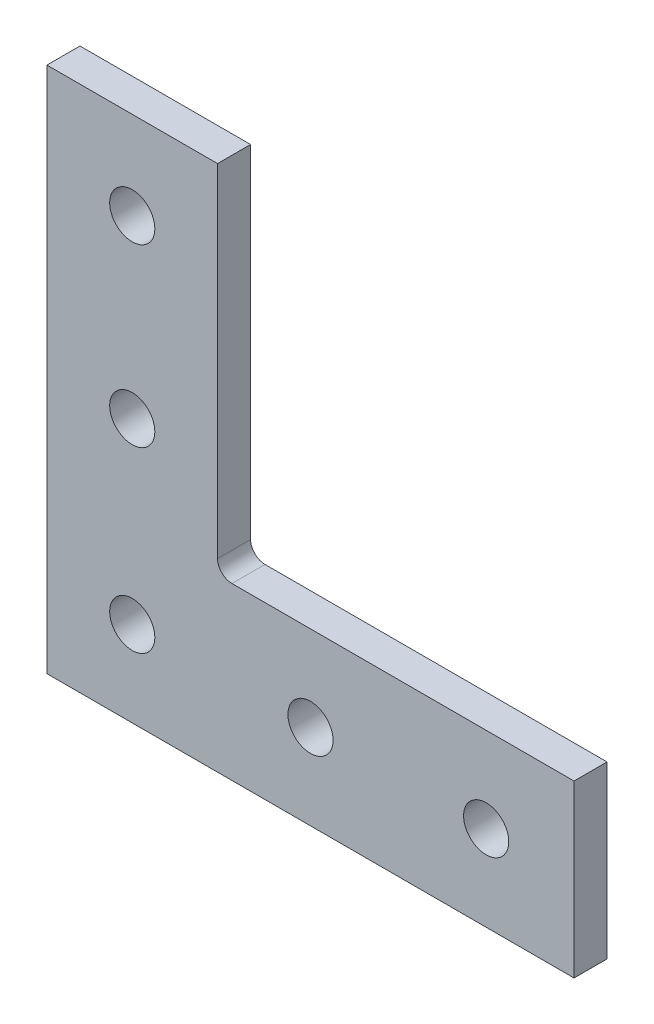
ISO-10303-21;
HEADER;
FILE_DESCRIPTION(('STEP AP214'),'2;1');
FILE_NAME('part.step','',(''),(''),'','','');
FILE_SCHEMA(('AUTOMOTIVE_DESIGN { 1 0 10303 214 1 1 1 1 }'));
ENDSEC;
DATA;
#1=APPLICATION_CONTEXT('core data for automotive mechanical design processes');
#2=APPLICATION_PROTOCOL_DEFINITION('international standard','automotive_design',2000,#1);
#3=PRODUCT_CONTEXT('',#1,'mechanical');
#4=PRODUCT('Part','Part','',(#3));
#5=PRODUCT_RELATED_PRODUCT_CATEGORY('part','',(#4));
#6=PRODUCT_DEFINITION_FORMATION('','',#4);
#7=PRODUCT_DEFINITION_CONTEXT('part definition',#1,'design');
#8=PRODUCT_DEFINITION('design','',#6,#7);
#9=PRODUCT_DEFINITION_SHAPE('','',#8);
#10=(LENGTH_UNIT() NAMED_UNIT(*) SI_UNIT(.MILLI.,.METRE.));
#11=(NAMED_UNIT(*) PLANE_ANGLE_UNIT() SI_UNIT($,.RADIAN.));
#12=(NAMED_UNIT(*) SI_UNIT($,.STERADIAN.) SOLID_ANGLE_UNIT());
#13=UNCERTAINTY_MEASURE_WITH_UNIT(LENGTH_MEASURE(1.E-05),#10,'distance_accuracy_value','');
#14=(GEOMETRIC_REPRESENTATION_CONTEXT(3) GLOBAL_UNCERTAINTY_ASSIGNED_CONTEXT((#13)) GLOBAL_UNIT_ASSIGNED_CONTEXT((#10,
#11,#12)) REPRESENTATION_CONTEXT('',''));
#15=CARTESIAN_POINT('',(0.,0.,0.));
#16=DIRECTION('',(0.,0.,1.));
#17=DIRECTION('',(1.,0.,0.));
#18=AXIS2_PLACEMENT_3D('',#15,#16,#17);
#19=CARTESIAN_POINT('',(-13.4366,-11.3538,-2.3876));
#20=DIRECTION('',(1.,0.,0.));
#21=DIRECTION('',(0.,1.,0.));
#22=AXIS2_PLACEMENT_3D('',#19,#20,#21);
#23=PLANE('',#22);
#24=DIRECTION('',(0.,0.,1.));
#25=VECTOR('',#24,1.);
#26=CARTESIAN_POINT('',(-13.4366,38.1,-2.3876));
#27=LINE('',#26,#25);
#28=CARTESIAN_POINT('',(-13.4366,38.1,-2.3876));
#29=VERTEX_POINT('',#28);
#30=CARTESIAN_POINT('',(-13.4366,38.1,2.3876));
#31=VERTEX_POINT('',#30);
#32=EDGE_CURVE('E103',#29,#31,#27,.T.);
#33=ORIENTED_EDGE('',*,*,#32,.T.);
#34=DIRECTION('',(0.,1.,0.));
#35=VECTOR('',#34,1.);
#36=CARTESIAN_POINT('',(-13.4366,-11.3538,2.3876));
#37=LINE('',#36,#35);
#38=CARTESIAN_POINT('',(-13.4366,-11.3538,2.3876));
#39=VERTEX_POINT('',#38);
#40=EDGE_CURVE('E106',#39,#31,#37,.T.);
#41=ORIENTED_EDGE('',*,*,#40,.F.);
#42=DIRECTION('',(0.,0.,1.));
#43=VECTOR('',#42,1.);
#44=CARTESIAN_POINT('',(-13.4366,-11.3538,-2.3876));
#45=LINE('',#44,#43);
#46=CARTESIAN_POINT('',(-13.4366,-11.3538,-2.3876));
#47=VERTEX_POINT('',#46);
#48=EDGE_CURVE('E11',#47,#39,#45,.T.);
#49=ORIENTED_EDGE('',*,*,#48,.F.);
#50=DIRECTION('',(0.,1.,0.));
#51=VECTOR('',#50,1.);
#52=CARTESIAN_POINT('',(-13.4366,-11.3538,-2.3876));
#53=LINE('',#52,#51);
#54=EDGE_CURVE('E107',#47,#29,#53,.T.);
#55=ORIENTED_EDGE('',*,*,#54,.T.);
#56=EDGE_LOOP('',(#33,#41,#49,#55));
#57=FACE_BOUND('',#56,.T.);
#58=ADVANCED_FACE('F46',(#57),#23,.T.);
#59=CARTESIAN_POINT('',(-11.3538,-11.3538,-2.3876));
#60=DIRECTION('',(0.,0.,1.));
#61=DIRECTION('',(1.,0.,0.));
#62=AXIS2_PLACEMENT_3D('',#59,#60,#61);
#63=CYLINDRICAL_SURFACE('',#62,2.0828);
#64=ORIENTED_EDGE('',*,*,#48,.T.);
#65=CARTESIAN_POINT('',(-11.3538,-11.3538,2.3876));
#66=DIRECTION('',(0.,0.,-1.));
#67=DIRECTION('',(-1.,0.,0.));
#68=AXIS2_PLACEMENT_3D('',#65,#66,#67);
#69=CIRCLE('',#68,2.0828);
#70=CARTESIAN_POINT('',(-11.3538,-13.4366,2.3876));
#71=VERTEX_POINT('',#70);
#72=EDGE_CURVE('E127',#71,#39,#69,.T.);
#73=ORIENTED_EDGE('',*,*,#72,.F.);
#74=DIRECTION('',(0.,0.,1.));
#75=VECTOR('',#74,1.);
#76=CARTESIAN_POINT('',(-11.3538,-13.4366,-2.3876));
#77=LINE('',#76,#75);
#78=CARTESIAN_POINT('',(-11.3538,-13.4366,-2.3876));
#79=VERTEX_POINT('',#78);
#80=EDGE_CURVE('E55',#79,#71,#77,.T.);
#81=ORIENTED_EDGE('',*,*,#80,.F.);
#82=CARTESIAN_POINT('',(-11.3538,-11.3538,-2.3876));
#83=DIRECTION('',(0.,0.,-1.));
#84=DIRECTION('',(-1.,0.,0.));
#85=AXIS2_PLACEMENT_3D('',#82,#83,#84);
#86=CIRCLE('',#85,2.0828);
#87=EDGE_CURVE('E113',#79,#47,#86,.T.);
#88=ORIENTED_EDGE('',*,*,#87,.T.);
#89=EDGE_LOOP('',(#64,#73,#81,#88));
#90=FACE_BOUND('',#89,.T.);
#91=ADVANCED_FACE('F225',(#90),#63,.F.);
#92=CARTESIAN_POINT('',(38.1,-13.4366,-2.3876));
#93=DIRECTION('',(0.,1.,0.));
#94=DIRECTION('',(-1.,0.,0.));
#95=AXIS2_PLACEMENT_3D('',#92,#93,#94);
#96=PLANE('',#95);
#97=ORIENTED_EDGE('',*,*,#80,.T.);
#98=DIRECTION('',(-1.,0.,0.));
#99=VECTOR('',#98,1.);
#100=CARTESIAN_POINT('',(38.1,-13.4366,2.3876));
#101=LINE('',#100,#99);
#102=CARTESIAN_POINT('',(38.1,-13.4366,2.3876));
#103=VERTEX_POINT('',#102);
#104=EDGE_CURVE('E148',#103,#71,#101,.T.);
#105=ORIENTED_EDGE('',*,*,#104,.F.);
#106=DIRECTION('',(0.,0.,1.));
#107=VECTOR('',#106,1.);
#108=CARTESIAN_POINT('',(38.1,-13.4366,-2.3876));
#109=LINE('',#108,#107);
#110=CARTESIAN_POINT('',(38.1,-13.4366,-2.3876));
#111=VERTEX_POINT('',#110);
#112=EDGE_CURVE('E177',#111,#103,#109,.T.);
#113=ORIENTED_EDGE('',*,*,#112,.F.);
#114=DIRECTION('',(-1.,0.,0.));
#115=VECTOR('',#114,1.);
#116=CARTESIAN_POINT('',(38.1,-13.4366,-2.3876));
#117=LINE('',#116,#115);
#118=EDGE_CURVE('E170',#111,#79,#117,.T.);
#119=ORIENTED_EDGE('',*,*,#118,.T.);
#120=EDGE_LOOP('',(#97,#105,#113,#119));
#121=FACE_BOUND('',#120,.T.);
#122=ADVANCED_FACE('F229',(#121),#96,.T.);
#123=CARTESIAN_POINT('',(38.1,-38.1,-2.3876));
#124=DIRECTION('',(1.,0.,0.));
#125=DIRECTION('',(0.,0.,-1.));
#126=AXIS2_PLACEMENT_3D('',#123,#124,#125);
#127=PLANE('',#126);
#128=ORIENTED_EDGE('',*,*,#112,.T.);
#129=DIRECTION('',(0.,1.,0.));
#130=VECTOR('',#129,1.);
#131=CARTESIAN_POINT('',(38.1,-38.1,2.3876));
#132=LINE('',#131,#130);
#133=CARTESIAN_POINT('',(38.1,-38.1,2.3876));
#134=VERTEX_POINT('',#133);
#135=EDGE_CURVE('E144',#134,#103,#132,.T.);
#136=ORIENTED_EDGE('',*,*,#135,.F.);
#137=DIRECTION('',(0.,0.,1.));
#138=VECTOR('',#137,1.);
#139=CARTESIAN_POINT('',(38.1,-38.1,-2.3876));
#140=LINE('',#139,#138);
#141=CARTESIAN_POINT('',(38.1,-38.1,-2.3876));
#142=VERTEX_POINT('',#141);
#143=EDGE_CURVE('E180',#142,#134,#140,.T.);
#144=ORIENTED_EDGE('',*,*,#143,.F.);
#145=DIRECTION('',(0.,1.,0.));
#146=VECTOR('',#145,1.);
#147=CARTESIAN_POINT('',(38.1,-38.1,-2.3876));
#148=LINE('',#147,#146);
#149=EDGE_CURVE('E166',#142,#111,#148,.T.);
#150=ORIENTED_EDGE('',*,*,#149,.T.);
#151=EDGE_LOOP('',(#128,#136,#144,#150));
#152=FACE_BOUND('',#151,.T.);
#153=ADVANCED_FACE('F234',(#152),#127,.T.);
#154=CARTESIAN_POINT('',(-38.1,-38.1,-2.3876));
#155=DIRECTION('',(0.,-1.,0.));
#156=DIRECTION('',(1.,0.,0.));
#157=AXIS2_PLACEMENT_3D('',#154,#155,#156);
#158=PLANE('',#157);
#159=ORIENTED_EDGE('',*,*,#143,.T.);
#160=DIRECTION('',(1.,0.,0.));
#161=VECTOR('',#160,1.);
#162=CARTESIAN_POINT('',(-38.1,-38.1,2.3876));
#163=LINE('',#162,#161);
#164=CARTESIAN_POINT('',(-38.1,-38.1,2.3876));
#165=VERTEX_POINT('',#164);
#166=EDGE_CURVE('E140',#165,#134,#163,.T.);
#167=ORIENTED_EDGE('',*,*,#166,.F.);
#168=DIRECTION('',(0.,0.,1.));
#169=VECTOR('',#168,1.);
#170=CARTESIAN_POINT('',(-38.1,-38.1,-2.3876));
#171=LINE('',#170,#169);
#172=CARTESIAN_POINT('',(-38.1,-38.1,-2.3876));
#173=VERTEX_POINT('',#172);
#174=EDGE_CURVE('E183',#173,#165,#171,.T.);
#175=ORIENTED_EDGE('',*,*,#174,.F.);
#176=DIRECTION('',(1.,0.,0.));
#177=VECTOR('',#176,1.);
#178=CARTESIAN_POINT('',(-38.1,-38.1,-2.3876));
#179=LINE('',#178,#177);
#180=EDGE_CURVE('E162',#173,#142,#179,.T.);
#181=ORIENTED_EDGE('',*,*,#180,.T.);
#182=EDGE_LOOP('',(#159,#167,#175,#181));
#183=FACE_BOUND('',#182,.T.);
#184=ADVANCED_FACE('F243',(#183),#158,.T.);
#185=CARTESIAN_POINT('',(-38.1,38.1,-2.3876));
#186=DIRECTION('',(-1.,0.,0.));
#187=DIRECTION('',(0.,-1.,0.));
#188=AXIS2_PLACEMENT_3D('',#185,#186,#187);
#189=PLANE('',#188);
#190=ORIENTED_EDGE('',*,*,#174,.T.);
#191=DIRECTION('',(0.,-1.,0.));
#192=VECTOR('',#191,1.);
#193=CARTESIAN_POINT('',(-38.1,38.1,2.3876));
#194=LINE('',#193,#192);
#195=CARTESIAN_POINT('',(-38.1,38.1,2.3876));
#196=VERTEX_POINT('',#195);
#197=EDGE_CURVE('E122',#196,#165,#194,.T.);
#198=ORIENTED_EDGE('',*,*,#197,.F.);
#199=DIRECTION('',(0.,0.,1.));
#200=VECTOR('',#199,1.);
#201=CARTESIAN_POINT('',(-38.1,38.1,-2.3876));
#202=LINE('',#201,#200);
#203=CARTESIAN_POINT('',(-38.1,38.1,-2.3876));
#204=VERTEX_POINT('',#203);
#205=EDGE_CURVE('E112',#204,#196,#202,.T.);
#206=ORIENTED_EDGE('',*,*,#205,.F.);
#207=DIRECTION('',(0.,-1.,0.));
#208=VECTOR('',#207,1.);
#209=CARTESIAN_POINT('',(-38.1,38.1,-2.3876));
#210=LINE('',#209,#208);
#211=EDGE_CURVE('E158',#204,#173,#210,.T.);
#212=ORIENTED_EDGE('',*,*,#211,.T.);
#213=EDGE_LOOP('',(#190,#198,#206,#212));
#214=FACE_BOUND('',#213,.T.);
#215=ADVANCED_FACE('F247',(#214),#189,.T.);
#216=CARTESIAN_POINT('',(-13.4366,38.1,-2.3876));
#217=DIRECTION('',(0.,1.,0.));
#218=DIRECTION('',(0.,0.,1.));
#219=AXIS2_PLACEMENT_3D('',#216,#217,#218);
#220=PLANE('',#219);
#221=ORIENTED_EDGE('',*,*,#205,.T.);
#222=DIRECTION('',(-1.,0.,0.));
#223=VECTOR('',#222,1.);
#224=CARTESIAN_POINT('',(-13.4366,38.1,2.3876));
#225=LINE('',#224,#223);
#226=EDGE_CURVE('E116',#31,#196,#225,.T.);
#227=ORIENTED_EDGE('',*,*,#226,.F.);
#228=ORIENTED_EDGE('',*,*,#32,.F.);
#229=DIRECTION('',(-1.,0.,0.));
#230=VECTOR('',#229,1.);
#231=CARTESIAN_POINT('',(-13.4366,38.1,-2.3876));
#232=LINE('',#231,#230);
#233=EDGE_CURVE('E155',#29,#204,#232,.T.);
#234=ORIENTED_EDGE('',*,*,#233,.T.);
#235=EDGE_LOOP('',(#221,#227,#228,#234));
#236=FACE_BOUND('',#235,.T.);
#237=ADVANCED_FACE('F117',(#236),#220,.T.);
#238=CARTESIAN_POINT('',(-11.3538,-11.3538,-2.3876));
#239=DIRECTION('',(0.,0.,-1.));
#240=DIRECTION('',(-1.,0.,0.));
#241=AXIS2_PLACEMENT_3D('',#238,#239,#240);
#242=PLANE('',#241);
#243=CARTESIAN_POINT('',(-25.7683,25.4,-2.3876));
#244=DIRECTION('',(0.,0.,1.));
#245=DIRECTION('',(1.,0.,0.));
#246=AXIS2_PLACEMENT_3D('',#243,#244,#245);
#247=CIRCLE('',#246,3.26389999999999);
#248=CARTESIAN_POINT('',(-22.5044,25.4,-2.3876));
#249=VERTEX_POINT('',#248);
#250=EDGE_CURVE('E193',#249,#249,#247,.T.);
#251=ORIENTED_EDGE('',*,*,#250,.T.);
#252=EDGE_LOOP('',(#251));
#253=FACE_BOUND('',#252,.T.);
#254=CARTESIAN_POINT('',(-25.7683,-25.7683,-2.3876));
#255=DIRECTION('',(0.,0.,1.));
#256=DIRECTION('',(1.,0.,0.));
#257=AXIS2_PLACEMENT_3D('',#254,#255,#256);
#258=CIRCLE('',#257,3.26389999999999);
#259=CARTESIAN_POINT('',(-22.5044,-25.7683,-2.3876));
#260=VERTEX_POINT('',#259);
#261=EDGE_CURVE('E266',#260,#260,#258,.T.);
#262=ORIENTED_EDGE('',*,*,#261,.T.);
#263=EDGE_LOOP('',(#262));
#264=FACE_BOUND('',#263,.T.);
#265=CARTESIAN_POINT('',(25.4,-25.7683,-2.3876));
#266=DIRECTION('',(0.,0.,1.));
#267=DIRECTION('',(-1.,0.,0.));
#268=AXIS2_PLACEMENT_3D('',#265,#266,#267);
#269=CIRCLE('',#268,3.26389999999999);
#270=CARTESIAN_POINT('',(22.1361,-25.7683,-2.3876));
#271=VERTEX_POINT('',#270);
#272=EDGE_CURVE('E270',#271,#271,#269,.T.);
#273=ORIENTED_EDGE('',*,*,#272,.T.);
#274=EDGE_LOOP('',(#273));
#275=FACE_BOUND('',#274,.T.);
#276=CARTESIAN_POINT('',(0.,-25.7683,-2.3876));
#277=DIRECTION('',(0.,0.,1.));
#278=DIRECTION('',(-1.,0.,0.));
#279=AXIS2_PLACEMENT_3D('',#276,#277,#278);
#280=CIRCLE('',#279,3.26389999999999);
#281=CARTESIAN_POINT('',(-3.2639,-25.7683,-2.3876));
#282=VERTEX_POINT('',#281);
#283=EDGE_CURVE('E135',#282,#282,#280,.T.);
#284=ORIENTED_EDGE('',*,*,#283,.T.);
#285=EDGE_LOOP('',(#284));
#286=FACE_BOUND('',#285,.T.);
#287=CARTESIAN_POINT('',(-25.7683,0.,-2.3876));
#288=DIRECTION('',(0.,0.,1.));
#289=DIRECTION('',(1.,0.,0.));
#290=AXIS2_PLACEMENT_3D('',#287,#288,#289);
#291=CIRCLE('',#290,3.26389999999999);
#292=CARTESIAN_POINT('',(-22.5044,0.,-2.3876));
#293=VERTEX_POINT('',#292);
#294=EDGE_CURVE('E277',#293,#293,#291,.T.);
#295=ORIENTED_EDGE('',*,*,#294,.T.);
#296=EDGE_LOOP('',(#295));
#297=FACE_BOUND('',#296,.T.);
#298=ORIENTED_EDGE('',*,*,#54,.F.);
#299=ORIENTED_EDGE('',*,*,#87,.F.);
#300=ORIENTED_EDGE('',*,*,#118,.F.);
#301=ORIENTED_EDGE('',*,*,#149,.F.);
#302=ORIENTED_EDGE('',*,*,#180,.F.);
#303=ORIENTED_EDGE('',*,*,#211,.F.);
#304=ORIENTED_EDGE('',*,*,#233,.F.);
#305=EDGE_LOOP('',(#298,#299,#300,#301,#302,#303,#304));
#306=FACE_BOUND('',#305,.T.);
#307=ADVANCED_FACE('F238',(#253,#264,#275,#286,#297,#306),#242,.T.);
#308=CARTESIAN_POINT('',(-11.3538,-11.3538,2.3876));
#309=DIRECTION('',(0.,0.,-1.));
#310=DIRECTION('',(-1.,0.,0.));
#311=AXIS2_PLACEMENT_3D('',#308,#309,#310);
#312=PLANE('',#311);
#313=CARTESIAN_POINT('',(-25.7683,25.4,2.3876));
#314=DIRECTION('',(0.,0.,-1.));
#315=DIRECTION('',(-1.,0.,0.));
#316=AXIS2_PLACEMENT_3D('',#313,#314,#315);
#317=CIRCLE('',#316,3.26389999999999);
#318=CARTESIAN_POINT('',(-29.0322,25.4,2.3876));
#319=VERTEX_POINT('',#318);
#320=EDGE_CURVE('E49',#319,#319,#317,.T.);
#321=ORIENTED_EDGE('',*,*,#320,.T.);
#322=EDGE_LOOP('',(#321));
#323=FACE_BOUND('',#322,.T.);
#324=CARTESIAN_POINT('',(-25.7683,-25.7683,2.3876));
#325=DIRECTION('',(0.,0.,-1.));
#326=DIRECTION('',(-1.,0.,0.));
#327=AXIS2_PLACEMENT_3D('',#324,#325,#326);
#328=CIRCLE('',#327,3.26389999999999);
#329=CARTESIAN_POINT('',(-29.0322,-25.7683,2.3876));
#330=VERTEX_POINT('',#329);
#331=EDGE_CURVE('E133',#330,#330,#328,.T.);
#332=ORIENTED_EDGE('',*,*,#331,.T.);
#333=EDGE_LOOP('',(#332));
#334=FACE_BOUND('',#333,.T.);
#335=CARTESIAN_POINT('',(25.4,-25.7683,2.3876));
#336=DIRECTION('',(0.,0.,-1.));
#337=DIRECTION('',(-1.,0.,0.));
#338=AXIS2_PLACEMENT_3D('',#335,#336,#337);
#339=CIRCLE('',#338,3.26389999999999);
#340=CARTESIAN_POINT('',(22.1361,-25.7683,2.3876));
#341=VERTEX_POINT('',#340);
#342=EDGE_CURVE('E197',#341,#341,#339,.T.);
#343=ORIENTED_EDGE('',*,*,#342,.T.);
#344=EDGE_LOOP('',(#343));
#345=FACE_BOUND('',#344,.T.);
#346=CARTESIAN_POINT('',(0.,-25.7683,2.3876));
#347=DIRECTION('',(0.,0.,-1.));
#348=DIRECTION('',(-1.,0.,0.));
#349=AXIS2_PLACEMENT_3D('',#346,#347,#348);
#350=CIRCLE('',#349,3.26389999999999);
#351=CARTESIAN_POINT('',(-3.2639,-25.7683,2.3876));
#352=VERTEX_POINT('',#351);
#353=EDGE_CURVE('E192',#352,#352,#350,.T.);
#354=ORIENTED_EDGE('',*,*,#353,.T.);
#355=EDGE_LOOP('',(#354));
#356=FACE_BOUND('',#355,.T.);
#357=CARTESIAN_POINT('',(-25.7683,0.,2.3876));
#358=DIRECTION('',(0.,0.,-1.));
#359=DIRECTION('',(-1.,0.,0.));
#360=AXIS2_PLACEMENT_3D('',#357,#358,#359);
#361=CIRCLE('',#360,3.26389999999999);
#362=CARTESIAN_POINT('',(-29.0322,0.,2.3876));
#363=VERTEX_POINT('',#362);
#364=EDGE_CURVE('E188',#363,#363,#361,.T.);
#365=ORIENTED_EDGE('',*,*,#364,.T.);
#366=EDGE_LOOP('',(#365));
#367=FACE_BOUND('',#366,.T.);
#368=ORIENTED_EDGE('',*,*,#40,.T.);
#369=ORIENTED_EDGE('',*,*,#226,.T.);
#370=ORIENTED_EDGE('',*,*,#197,.T.);
#371=ORIENTED_EDGE('',*,*,#166,.T.);
#372=ORIENTED_EDGE('',*,*,#135,.T.);
#373=ORIENTED_EDGE('',*,*,#104,.T.);
#374=ORIENTED_EDGE('',*,*,#72,.T.);
#375=EDGE_LOOP('',(#368,#369,#370,#371,#372,#373,#374));
#376=FACE_BOUND('',#375,.T.);
#377=ADVANCED_FACE('F125',(#323,#334,#345,#356,#367,#376),#312,.F.);
#378=CARTESIAN_POINT('',(-25.7683,0.,-2.3876));
#379=DIRECTION('',(0.,0.,1.));
#380=DIRECTION('',(1.,0.,0.));
#381=AXIS2_PLACEMENT_3D('',#378,#379,#380);
#382=CYLINDRICAL_SURFACE('',#381,3.26389999999999);
#383=ORIENTED_EDGE('',*,*,#294,.F.);
#384=EDGE_LOOP('',(#383));
#385=FACE_BOUND('',#384,.T.);
#386=ORIENTED_EDGE('',*,*,#364,.F.);
#387=EDGE_LOOP('',(#386));
#388=FACE_BOUND('',#387,.T.);
#389=ADVANCED_FACE('F259',(#385,#388),#382,.F.);
#390=CARTESIAN_POINT('',(0.,-25.7683,-2.3876));
#391=DIRECTION('',(0.,0.,1.));
#392=DIRECTION('',(1.,0.,0.));
#393=AXIS2_PLACEMENT_3D('',#390,#391,#392);
#394=CYLINDRICAL_SURFACE('',#393,3.26389999999999);
#395=ORIENTED_EDGE('',*,*,#283,.F.);
#396=EDGE_LOOP('',(#395));
#397=FACE_BOUND('',#396,.T.);
#398=ORIENTED_EDGE('',*,*,#353,.F.);
#399=EDGE_LOOP('',(#398));
#400=FACE_BOUND('',#399,.T.);
#401=ADVANCED_FACE('F219',(#397,#400),#394,.F.);
#402=CARTESIAN_POINT('',(25.4,-25.7683,-2.3876));
#403=DIRECTION('',(0.,0.,1.));
#404=DIRECTION('',(1.,0.,0.));
#405=AXIS2_PLACEMENT_3D('',#402,#403,#404);
#406=CYLINDRICAL_SURFACE('',#405,3.26389999999999);
#407=ORIENTED_EDGE('',*,*,#272,.F.);
#408=EDGE_LOOP('',(#407));
#409=FACE_BOUND('',#408,.T.);
#410=ORIENTED_EDGE('',*,*,#342,.F.);
#411=EDGE_LOOP('',(#410));
#412=FACE_BOUND('',#411,.T.);
#413=ADVANCED_FACE('F210',(#409,#412),#406,.F.);
#414=CARTESIAN_POINT('',(-25.7683,-25.7683,-2.3876));
#415=DIRECTION('',(0.,0.,1.));
#416=DIRECTION('',(1.,0.,0.));
#417=AXIS2_PLACEMENT_3D('',#414,#415,#416);
#418=CYLINDRICAL_SURFACE('',#417,3.26389999999999);
#419=ORIENTED_EDGE('',*,*,#261,.F.);
#420=EDGE_LOOP('',(#419));
#421=FACE_BOUND('',#420,.T.);
#422=ORIENTED_EDGE('',*,*,#331,.F.);
#423=EDGE_LOOP('',(#422));
#424=FACE_BOUND('',#423,.T.);
#425=ADVANCED_FACE('F207',(#421,#424),#418,.F.);
#426=CARTESIAN_POINT('',(-25.7683,25.4,-2.3876));
#427=DIRECTION('',(0.,0.,1.));
#428=DIRECTION('',(1.,0.,0.));
#429=AXIS2_PLACEMENT_3D('',#426,#427,#428);
#430=CYLINDRICAL_SURFACE('',#429,3.26389999999999);
#431=ORIENTED_EDGE('',*,*,#250,.F.);
#432=EDGE_LOOP('',(#431));
#433=FACE_BOUND('',#432,.T.);
#434=ORIENTED_EDGE('',*,*,#320,.F.);
#435=EDGE_LOOP('',(#434));
#436=FACE_BOUND('',#435,.T.);
#437=ADVANCED_FACE('F209',(#433,#436),#430,.F.);
#438=CLOSED_SHELL('',(#58,#91,#122,#153,#184,#215,#237,#307,#377,#389,#401,#413,#425,#437));
#439=MANIFOLD_SOLID_BREP('B2',#438);
#440=ADVANCED_BREP_SHAPE_REPRESENTATION('',(#18,#439),#14);
#441=SHAPE_DEFINITION_REPRESENTATION(#9,#440);
ENDSEC;
END-ISO-10303-21;
